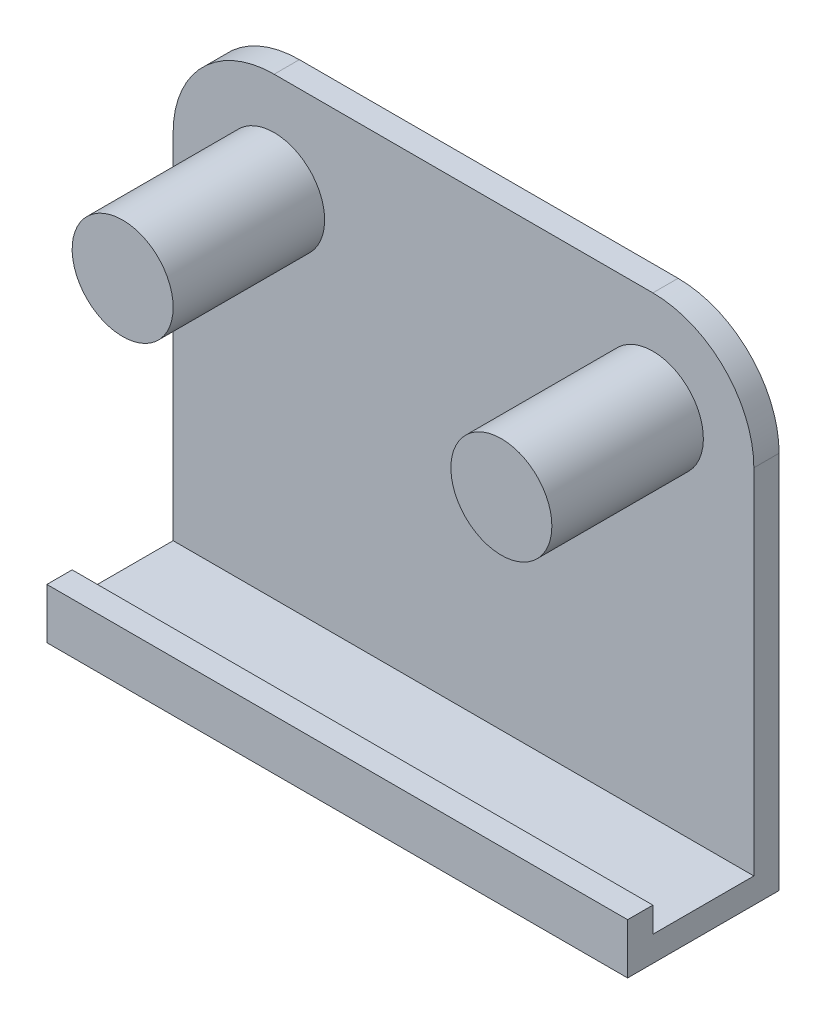
ISO-10303-21;
HEADER;
FILE_DESCRIPTION(('STEP AP214'),'2;1');
FILE_NAME('part.step','',(''),(''),'','','');
FILE_SCHEMA(('AUTOMOTIVE_DESIGN { 1 0 10303 214 1 1 1 1 }'));
ENDSEC;
DATA;
#1=APPLICATION_CONTEXT('core data for automotive mechanical design processes');
#2=APPLICATION_PROTOCOL_DEFINITION('international standard','automotive_design',2000,#1);
#3=PRODUCT_CONTEXT('',#1,'mechanical');
#4=PRODUCT('Part','Part','',(#3));
#5=PRODUCT_RELATED_PRODUCT_CATEGORY('part','',(#4));
#6=PRODUCT_DEFINITION_FORMATION('','',#4);
#7=PRODUCT_DEFINITION_CONTEXT('part definition',#1,'design');
#8=PRODUCT_DEFINITION('design','',#6,#7);
#9=PRODUCT_DEFINITION_SHAPE('','',#8);
#10=(LENGTH_UNIT() NAMED_UNIT(*) SI_UNIT(.MILLI.,.METRE.));
#11=(NAMED_UNIT(*) PLANE_ANGLE_UNIT() SI_UNIT($,.RADIAN.));
#12=(NAMED_UNIT(*) SI_UNIT($,.STERADIAN.) SOLID_ANGLE_UNIT());
#13=UNCERTAINTY_MEASURE_WITH_UNIT(LENGTH_MEASURE(1.E-05),#10,'distance_accuracy_value','');
#14=(GEOMETRIC_REPRESENTATION_CONTEXT(3) GLOBAL_UNCERTAINTY_ASSIGNED_CONTEXT((#13)) GLOBAL_UNIT_ASSIGNED_CONTEXT((#10,
#11,#12)) REPRESENTATION_CONTEXT('',''));
#15=CARTESIAN_POINT('',(0.,0.,0.));
#16=DIRECTION('',(0.,0.,1.));
#17=DIRECTION('',(1.,0.,0.));
#18=AXIS2_PLACEMENT_3D('',#15,#16,#17);
#19=CARTESIAN_POINT('',(115.,0.,25.));
#20=DIRECTION('',(0.,0.,1.));
#21=DIRECTION('',(1.,0.,0.));
#22=AXIS2_PLACEMENT_3D('',#19,#20,#21);
#23=PLANE('',#22);
#24=DIRECTION('',(0.,1.,0.));
#25=VECTOR('',#24,1.);
#26=CARTESIAN_POINT('',(0.,0.,25.));
#27=LINE('',#26,#25);
#28=CARTESIAN_POINT('',(0.,5.,25.));
#29=VERTEX_POINT('',#28);
#30=CARTESIAN_POINT('',(0.,10.,25.));
#31=VERTEX_POINT('',#30);
#32=EDGE_CURVE('E129',#29,#31,#27,.T.);
#33=ORIENTED_EDGE('',*,*,#32,.T.);
#34=DIRECTION('',(-1.,0.,0.));
#35=VECTOR('',#34,1.);
#36=CARTESIAN_POINT('',(115.,10.,25.));
#37=LINE('',#36,#35);
#38=CARTESIAN_POINT('',(115.,10.,25.));
#39=VERTEX_POINT('',#38);
#40=EDGE_CURVE('E127',#39,#31,#37,.T.);
#41=ORIENTED_EDGE('',*,*,#40,.F.);
#42=DIRECTION('',(0.,1.,0.));
#43=VECTOR('',#42,1.);
#44=CARTESIAN_POINT('',(115.,0.,25.));
#45=LINE('',#44,#43);
#46=CARTESIAN_POINT('',(115.,5.,25.));
#47=VERTEX_POINT('',#46);
#48=EDGE_CURVE('E112',#47,#39,#45,.T.);
#49=ORIENTED_EDGE('',*,*,#48,.F.);
#50=DIRECTION('',(-1.,0.,0.));
#51=VECTOR('',#50,1.);
#52=CARTESIAN_POINT('',(115.,5.,25.));
#53=LINE('',#52,#51);
#54=EDGE_CURVE('E150',#47,#29,#53,.T.);
#55=ORIENTED_EDGE('',*,*,#54,.T.);
#56=EDGE_LOOP('',(#33,#41,#49,#55));
#57=FACE_BOUND('',#56,.T.);
#58=ADVANCED_FACE('F33',(#57),#23,.F.);
#59=CARTESIAN_POINT('',(115.,10.,30.));
#60=DIRECTION('',(0.,1.,0.));
#61=DIRECTION('',(0.,0.,1.));
#62=AXIS2_PLACEMENT_3D('',#59,#60,#61);
#63=PLANE('',#62);
#64=DIRECTION('',(0.,0.,-1.));
#65=VECTOR('',#64,1.);
#66=CARTESIAN_POINT('',(0.,10.,30.));
#67=LINE('',#66,#65);
#68=CARTESIAN_POINT('',(0.,10.,30.));
#69=VERTEX_POINT('',#68);
#70=EDGE_CURVE('E152',#69,#31,#67,.T.);
#71=ORIENTED_EDGE('',*,*,#70,.F.);
#72=DIRECTION('',(-1.,0.,0.));
#73=VECTOR('',#72,1.);
#74=CARTESIAN_POINT('',(115.,10.,30.));
#75=LINE('',#74,#73);
#76=CARTESIAN_POINT('',(115.,10.,30.));
#77=VERTEX_POINT('',#76);
#78=EDGE_CURVE('E134',#77,#69,#75,.T.);
#79=ORIENTED_EDGE('',*,*,#78,.F.);
#80=DIRECTION('',(0.,0.,-1.));
#81=VECTOR('',#80,1.);
#82=CARTESIAN_POINT('',(115.,10.,30.));
#83=LINE('',#82,#81);
#84=EDGE_CURVE('E117',#77,#39,#83,.T.);
#85=ORIENTED_EDGE('',*,*,#84,.T.);
#86=ORIENTED_EDGE('',*,*,#40,.T.);
#87=EDGE_LOOP('',(#71,#79,#85,#86));
#88=FACE_BOUND('',#87,.T.);
#89=ADVANCED_FACE('F136',(#88),#63,.T.);
#90=CARTESIAN_POINT('',(115.,0.,30.));
#91=DIRECTION('',(0.,0.,1.));
#92=DIRECTION('',(1.,0.,0.));
#93=AXIS2_PLACEMENT_3D('',#90,#91,#92);
#94=PLANE('',#93);
#95=DIRECTION('',(0.,1.,0.));
#96=VECTOR('',#95,1.);
#97=CARTESIAN_POINT('',(0.,0.,30.));
#98=LINE('',#97,#96);
#99=CARTESIAN_POINT('',(0.,0.,30.));
#100=VERTEX_POINT('',#99);
#101=EDGE_CURVE('E155',#100,#69,#98,.T.);
#102=ORIENTED_EDGE('',*,*,#101,.F.);
#103=DIRECTION('',(-1.,0.,0.));
#104=VECTOR('',#103,1.);
#105=CARTESIAN_POINT('',(115.,0.,30.));
#106=LINE('',#105,#104);
#107=CARTESIAN_POINT('',(115.,0.,30.));
#108=VERTEX_POINT('',#107);
#109=EDGE_CURVE('E177',#108,#100,#106,.T.);
#110=ORIENTED_EDGE('',*,*,#109,.F.);
#111=DIRECTION('',(0.,1.,0.));
#112=VECTOR('',#111,1.);
#113=CARTESIAN_POINT('',(115.,0.,30.));
#114=LINE('',#113,#112);
#115=EDGE_CURVE('E137',#108,#77,#114,.T.);
#116=ORIENTED_EDGE('',*,*,#115,.T.);
#117=ORIENTED_EDGE('',*,*,#78,.T.);
#118=EDGE_LOOP('',(#102,#110,#116,#117));
#119=FACE_BOUND('',#118,.T.);
#120=ADVANCED_FACE('F227',(#119),#94,.T.);
#121=CARTESIAN_POINT('',(115.,0.,0.));
#122=DIRECTION('',(0.,-1.,0.));
#123=DIRECTION('',(0.,0.,-1.));
#124=AXIS2_PLACEMENT_3D('',#121,#122,#123);
#125=PLANE('',#124);
#126=DIRECTION('',(0.,0.,1.));
#127=VECTOR('',#126,1.);
#128=CARTESIAN_POINT('',(0.,0.,0.));
#129=LINE('',#128,#127);
#130=CARTESIAN_POINT('',(0.,0.,0.));
#131=VERTEX_POINT('',#130);
#132=EDGE_CURVE('E158',#131,#100,#129,.T.);
#133=ORIENTED_EDGE('',*,*,#132,.F.);
#134=DIRECTION('',(-1.,0.,0.));
#135=VECTOR('',#134,1.);
#136=CARTESIAN_POINT('',(115.,0.,0.));
#137=LINE('',#136,#135);
#138=CARTESIAN_POINT('',(115.,0.,0.));
#139=VERTEX_POINT('',#138);
#140=EDGE_CURVE('E174',#139,#131,#137,.T.);
#141=ORIENTED_EDGE('',*,*,#140,.F.);
#142=DIRECTION('',(0.,0.,1.));
#143=VECTOR('',#142,1.);
#144=CARTESIAN_POINT('',(115.,0.,0.));
#145=LINE('',#144,#143);
#146=EDGE_CURVE('E139',#139,#108,#145,.T.);
#147=ORIENTED_EDGE('',*,*,#146,.T.);
#148=ORIENTED_EDGE('',*,*,#109,.T.);
#149=EDGE_LOOP('',(#133,#141,#147,#148));
#150=FACE_BOUND('',#149,.T.);
#151=ADVANCED_FACE('F224',(#150),#125,.T.);
#152=CARTESIAN_POINT('',(115.,95.,0.));
#153=DIRECTION('',(0.,0.,-1.));
#154=DIRECTION('',(0.,1.,0.));
#155=AXIS2_PLACEMENT_3D('',#152,#153,#154);
#156=PLANE('',#155);
#157=DIRECTION('',(0.,-1.,0.));
#158=VECTOR('',#157,1.);
#159=CARTESIAN_POINT('',(0.,95.,0.));
#160=LINE('',#159,#158);
#161=CARTESIAN_POINT('',(0.,75.,0.));
#162=VERTEX_POINT('',#161);
#163=EDGE_CURVE('E161',#162,#131,#160,.T.);
#164=ORIENTED_EDGE('',*,*,#163,.F.);
#165=CARTESIAN_POINT('',(20.,75.,0.));
#166=DIRECTION('',(0.,0.,-1.));
#167=DIRECTION('',(0.,1.,0.));
#168=AXIS2_PLACEMENT_3D('',#165,#166,#167);
#169=CIRCLE('',#168,20.);
#170=CARTESIAN_POINT('',(20.,95.,0.));
#171=VERTEX_POINT('',#170);
#172=EDGE_CURVE('E184',#162,#171,#169,.T.);
#173=ORIENTED_EDGE('',*,*,#172,.T.);
#174=DIRECTION('',(-1.,0.,0.));
#175=VECTOR('',#174,1.);
#176=CARTESIAN_POINT('',(115.,95.,0.));
#177=LINE('',#176,#175);
#178=CARTESIAN_POINT('',(95.,95.,0.));
#179=VERTEX_POINT('',#178);
#180=EDGE_CURVE('E172',#179,#171,#177,.T.);
#181=ORIENTED_EDGE('',*,*,#180,.F.);
#182=CARTESIAN_POINT('',(95.,75.,0.));
#183=DIRECTION('',(0.,0.,-1.));
#184=DIRECTION('',(0.,1.,0.));
#185=AXIS2_PLACEMENT_3D('',#182,#183,#184);
#186=CIRCLE('',#185,20.);
#187=CARTESIAN_POINT('',(115.,75.,0.));
#188=VERTEX_POINT('',#187);
#189=EDGE_CURVE('E182',#179,#188,#186,.T.);
#190=ORIENTED_EDGE('',*,*,#189,.T.);
#191=DIRECTION('',(0.,-1.,0.));
#192=VECTOR('',#191,1.);
#193=CARTESIAN_POINT('',(115.,95.,0.));
#194=LINE('',#193,#192);
#195=EDGE_CURVE('E145',#188,#139,#194,.T.);
#196=ORIENTED_EDGE('',*,*,#195,.T.);
#197=ORIENTED_EDGE('',*,*,#140,.T.);
#198=EDGE_LOOP('',(#164,#173,#181,#190,#196,#197));
#199=FACE_BOUND('',#198,.T.);
#200=ADVANCED_FACE('F218',(#199),#156,.T.);
#201=CARTESIAN_POINT('',(115.,95.,5.));
#202=DIRECTION('',(0.,1.,0.));
#203=DIRECTION('',(0.,0.,1.));
#204=AXIS2_PLACEMENT_3D('',#201,#202,#203);
#205=PLANE('',#204);
#206=ORIENTED_EDGE('',*,*,#180,.T.);
#207=DIRECTION('',(0.,0.,-1.));
#208=VECTOR('',#207,1.);
#209=CARTESIAN_POINT('',(20.,95.,5.));
#210=LINE('',#209,#208);
#211=CARTESIAN_POINT('',(20.,95.,5.));
#212=VERTEX_POINT('',#211);
#213=EDGE_CURVE('E56',#171,#212,#210,.F.);
#214=ORIENTED_EDGE('',*,*,#213,.T.);
#215=DIRECTION('',(-1.,0.,0.));
#216=VECTOR('',#215,1.);
#217=CARTESIAN_POINT('',(115.,95.,5.));
#218=LINE('',#217,#216);
#219=CARTESIAN_POINT('',(95.,95.,5.));
#220=VERTEX_POINT('',#219);
#221=EDGE_CURVE('E170',#220,#212,#218,.T.);
#222=ORIENTED_EDGE('',*,*,#221,.F.);
#223=DIRECTION('',(0.,0.,-1.));
#224=VECTOR('',#223,1.);
#225=CARTESIAN_POINT('',(95.,95.,0.));
#226=LINE('',#225,#224);
#227=EDGE_CURVE('E186',#220,#179,#226,.T.);
#228=ORIENTED_EDGE('',*,*,#227,.T.);
#229=EDGE_LOOP('',(#206,#214,#222,#228));
#230=FACE_BOUND('',#229,.T.);
#231=ADVANCED_FACE('F203',(#230),#205,.T.);
#232=CARTESIAN_POINT('',(115.,95.,5.));
#233=DIRECTION('',(0.,0.,-1.));
#234=DIRECTION('',(0.,1.,0.));
#235=AXIS2_PLACEMENT_3D('',#232,#233,#234);
#236=PLANE('',#235);
#237=CARTESIAN_POINT('',(95.,75.,5.));
#238=DIRECTION('',(0.,0.,-1.));
#239=DIRECTION('',(0.,1.,0.));
#240=AXIS2_PLACEMENT_3D('',#237,#238,#239);
#241=CIRCLE('',#240,9.99999999999999);
#242=CARTESIAN_POINT('',(95.,85.,5.));
#243=VERTEX_POINT('',#242);
#244=EDGE_CURVE('E11',#243,#243,#241,.F.);
#245=ORIENTED_EDGE('',*,*,#244,.F.);
#246=EDGE_LOOP('',(#245));
#247=FACE_BOUND('',#246,.T.);
#248=CARTESIAN_POINT('',(20.,75.,5.));
#249=DIRECTION('',(0.,0.,-1.));
#250=DIRECTION('',(0.,1.,0.));
#251=AXIS2_PLACEMENT_3D('',#248,#249,#250);
#252=CIRCLE('',#251,10.);
#253=CARTESIAN_POINT('',(20.,85.,5.));
#254=VERTEX_POINT('',#253);
#255=EDGE_CURVE('E41',#254,#254,#252,.F.);
#256=ORIENTED_EDGE('',*,*,#255,.F.);
#257=EDGE_LOOP('',(#256));
#258=FACE_BOUND('',#257,.T.);
#259=ORIENTED_EDGE('',*,*,#221,.T.);
#260=CARTESIAN_POINT('',(20.,75.,5.));
#261=DIRECTION('',(0.,0.,-1.));
#262=DIRECTION('',(0.,1.,0.));
#263=AXIS2_PLACEMENT_3D('',#260,#261,#262);
#264=CIRCLE('',#263,20.);
#265=CARTESIAN_POINT('',(0.,75.,5.));
#266=VERTEX_POINT('',#265);
#267=EDGE_CURVE('E192',#212,#266,#264,.F.);
#268=ORIENTED_EDGE('',*,*,#267,.T.);
#269=DIRECTION('',(0.,-1.,0.));
#270=VECTOR('',#269,1.);
#271=CARTESIAN_POINT('',(0.,95.,5.));
#272=LINE('',#271,#270);
#273=CARTESIAN_POINT('',(0.,5.,5.));
#274=VERTEX_POINT('',#273);
#275=EDGE_CURVE('E163',#266,#274,#272,.T.);
#276=ORIENTED_EDGE('',*,*,#275,.T.);
#277=DIRECTION('',(-1.,0.,0.));
#278=VECTOR('',#277,1.);
#279=CARTESIAN_POINT('',(115.,5.,5.));
#280=LINE('',#279,#278);
#281=CARTESIAN_POINT('',(115.,5.,5.));
#282=VERTEX_POINT('',#281);
#283=EDGE_CURVE('E167',#282,#274,#280,.T.);
#284=ORIENTED_EDGE('',*,*,#283,.F.);
#285=DIRECTION('',(0.,-1.,0.));
#286=VECTOR('',#285,1.);
#287=CARTESIAN_POINT('',(115.,95.,5.));
#288=LINE('',#287,#286);
#289=CARTESIAN_POINT('',(115.,75.,5.));
#290=VERTEX_POINT('',#289);
#291=EDGE_CURVE('E147',#290,#282,#288,.T.);
#292=ORIENTED_EDGE('',*,*,#291,.F.);
#293=CARTESIAN_POINT('',(95.,75.,5.));
#294=DIRECTION('',(0.,0.,-1.));
#295=DIRECTION('',(0.,1.,0.));
#296=AXIS2_PLACEMENT_3D('',#293,#294,#295);
#297=CIRCLE('',#296,20.);
#298=EDGE_CURVE('E190',#290,#220,#297,.F.);
#299=ORIENTED_EDGE('',*,*,#298,.T.);
#300=EDGE_LOOP('',(#259,#268,#276,#284,#292,#299));
#301=FACE_BOUND('',#300,.T.);
#302=ADVANCED_FACE('F199',(#247,#258,#301),#236,.F.);
#303=CARTESIAN_POINT('',(115.,5.,0.));
#304=DIRECTION('',(0.,-1.,0.));
#305=DIRECTION('',(0.,0.,-1.));
#306=AXIS2_PLACEMENT_3D('',#303,#304,#305);
#307=PLANE('',#306);
#308=DIRECTION('',(0.,0.,1.));
#309=VECTOR('',#308,1.);
#310=CARTESIAN_POINT('',(0.,5.,0.));
#311=LINE('',#310,#309);
#312=EDGE_CURVE('E124',#274,#29,#311,.T.);
#313=ORIENTED_EDGE('',*,*,#312,.T.);
#314=ORIENTED_EDGE('',*,*,#54,.F.);
#315=DIRECTION('',(0.,0.,1.));
#316=VECTOR('',#315,1.);
#317=CARTESIAN_POINT('',(115.,5.,0.));
#318=LINE('',#317,#316);
#319=EDGE_CURVE('E120',#282,#47,#318,.T.);
#320=ORIENTED_EDGE('',*,*,#319,.F.);
#321=ORIENTED_EDGE('',*,*,#283,.T.);
#322=EDGE_LOOP('',(#313,#314,#320,#321));
#323=FACE_BOUND('',#322,.T.);
#324=ADVANCED_FACE('F202',(#323),#307,.F.);
#325=CARTESIAN_POINT('',(115.,0.,0.));
#326=DIRECTION('',(-1.,0.,0.));
#327=DIRECTION('',(0.,0.,1.));
#328=AXIS2_PLACEMENT_3D('',#325,#326,#327);
#329=PLANE('',#328);
#330=ORIENTED_EDGE('',*,*,#195,.F.);
#331=DIRECTION('',(0.,0.,-1.));
#332=VECTOR('',#331,1.);
#333=CARTESIAN_POINT('',(115.,75.,5.));
#334=LINE('',#333,#332);
#335=EDGE_CURVE('E48',#188,#290,#334,.F.);
#336=ORIENTED_EDGE('',*,*,#335,.T.);
#337=ORIENTED_EDGE('',*,*,#291,.T.);
#338=ORIENTED_EDGE('',*,*,#319,.T.);
#339=ORIENTED_EDGE('',*,*,#48,.T.);
#340=ORIENTED_EDGE('',*,*,#84,.F.);
#341=ORIENTED_EDGE('',*,*,#115,.F.);
#342=ORIENTED_EDGE('',*,*,#146,.F.);
#343=EDGE_LOOP('',(#330,#336,#337,#338,#339,#340,#341,#342));
#344=FACE_BOUND('',#343,.T.);
#345=ADVANCED_FACE('F114',(#344),#329,.F.);
#346=CARTESIAN_POINT('',(0.,0.,0.));
#347=DIRECTION('',(-1.,0.,0.));
#348=DIRECTION('',(0.,0.,1.));
#349=AXIS2_PLACEMENT_3D('',#346,#347,#348);
#350=PLANE('',#349);
#351=ORIENTED_EDGE('',*,*,#275,.F.);
#352=DIRECTION('',(0.,0.,-1.));
#353=VECTOR('',#352,1.);
#354=CARTESIAN_POINT('',(0.,75.,0.));
#355=LINE('',#354,#353);
#356=EDGE_CURVE('E133',#266,#162,#355,.T.);
#357=ORIENTED_EDGE('',*,*,#356,.T.);
#358=ORIENTED_EDGE('',*,*,#163,.T.);
#359=ORIENTED_EDGE('',*,*,#132,.T.);
#360=ORIENTED_EDGE('',*,*,#101,.T.);
#361=ORIENTED_EDGE('',*,*,#70,.T.);
#362=ORIENTED_EDGE('',*,*,#32,.F.);
#363=ORIENTED_EDGE('',*,*,#312,.F.);
#364=EDGE_LOOP('',(#351,#357,#358,#359,#360,#361,#362,#363));
#365=FACE_BOUND('',#364,.T.);
#366=ADVANCED_FACE('F215',(#365),#350,.T.);
#367=CARTESIAN_POINT('',(20.,75.,0.));
#368=DIRECTION('',(0.,0.,-1.));
#369=DIRECTION('',(-1.,0.,0.));
#370=AXIS2_PLACEMENT_3D('',#367,#368,#369);
#371=CYLINDRICAL_SURFACE('',#370,20.);
#372=ORIENTED_EDGE('',*,*,#267,.F.);
#373=ORIENTED_EDGE('',*,*,#213,.F.);
#374=ORIENTED_EDGE('',*,*,#172,.F.);
#375=ORIENTED_EDGE('',*,*,#356,.F.);
#376=EDGE_LOOP('',(#372,#373,#374,#375));
#377=FACE_BOUND('',#376,.T.);
#378=ADVANCED_FACE('F212',(#377),#371,.T.);
#379=CARTESIAN_POINT('',(95.,75.,5.));
#380=DIRECTION('',(0.,0.,1.));
#381=DIRECTION('',(1.,0.,0.));
#382=AXIS2_PLACEMENT_3D('',#379,#380,#381);
#383=CYLINDRICAL_SURFACE('',#382,20.);
#384=ORIENTED_EDGE('',*,*,#298,.F.);
#385=ORIENTED_EDGE('',*,*,#335,.F.);
#386=ORIENTED_EDGE('',*,*,#189,.F.);
#387=ORIENTED_EDGE('',*,*,#227,.F.);
#388=EDGE_LOOP('',(#384,#385,#386,#387));
#389=FACE_BOUND('',#388,.T.);
#390=ADVANCED_FACE('F35',(#389),#383,.T.);
#391=CARTESIAN_POINT('',(20.,75.,35.));
#392=DIRECTION('',(0.,0.,-1.));
#393=DIRECTION('',(-1.,0.,0.));
#394=AXIS2_PLACEMENT_3D('',#391,#392,#393);
#395=CYLINDRICAL_SURFACE('',#394,10.);
#396=CARTESIAN_POINT('',(20.,75.,35.));
#397=DIRECTION('',(0.,0.,1.));
#398=DIRECTION('',(1.,0.,0.));
#399=AXIS2_PLACEMENT_3D('',#396,#397,#398);
#400=CIRCLE('',#399,10.);
#401=CARTESIAN_POINT('',(30.,75.,35.));
#402=VERTEX_POINT('',#401);
#403=EDGE_CURVE('E153',#402,#402,#400,.T.);
#404=ORIENTED_EDGE('',*,*,#403,.F.);
#405=EDGE_LOOP('',(#404));
#406=FACE_BOUND('',#405,.T.);
#407=ORIENTED_EDGE('',*,*,#255,.T.);
#408=EDGE_LOOP('',(#407));
#409=FACE_BOUND('',#408,.T.);
#410=ADVANCED_FACE('F197',(#406,#409),#395,.T.);
#411=CARTESIAN_POINT('',(20.,75.,35.));
#412=DIRECTION('',(0.,0.,1.));
#413=DIRECTION('',(1.,0.,0.));
#414=AXIS2_PLACEMENT_3D('',#411,#412,#413);
#415=PLANE('',#414);
#416=ORIENTED_EDGE('',*,*,#403,.T.);
#417=EDGE_LOOP('',(#416));
#418=FACE_BOUND('',#417,.T.);
#419=ADVANCED_FACE('F296',(#418),#415,.T.);
#420=CARTESIAN_POINT('',(95.,75.,35.));
#421=DIRECTION('',(0.,0.,-1.));
#422=DIRECTION('',(-1.,0.,0.));
#423=AXIS2_PLACEMENT_3D('',#420,#421,#422);
#424=CYLINDRICAL_SURFACE('',#423,9.99999999999999);
#425=CARTESIAN_POINT('',(95.,75.,35.));
#426=DIRECTION('',(0.,0.,1.));
#427=DIRECTION('',(1.,0.,0.));
#428=AXIS2_PLACEMENT_3D('',#425,#426,#427);
#429=CIRCLE('',#428,9.99999999999999);
#430=CARTESIAN_POINT('',(105.,75.,35.));
#431=VERTEX_POINT('',#430);
#432=EDGE_CURVE('E331',#431,#431,#429,.T.);
#433=ORIENTED_EDGE('',*,*,#432,.F.);
#434=EDGE_LOOP('',(#433));
#435=FACE_BOUND('',#434,.T.);
#436=ORIENTED_EDGE('',*,*,#244,.T.);
#437=EDGE_LOOP('',(#436));
#438=FACE_BOUND('',#437,.T.);
#439=ADVANCED_FACE('F305',(#435,#438),#424,.T.);
#440=CARTESIAN_POINT('',(95.,75.,35.));
#441=DIRECTION('',(0.,0.,1.));
#442=DIRECTION('',(1.,0.,0.));
#443=AXIS2_PLACEMENT_3D('',#440,#441,#442);
#444=PLANE('',#443);
#445=ORIENTED_EDGE('',*,*,#432,.T.);
#446=EDGE_LOOP('',(#445));
#447=FACE_BOUND('',#446,.T.);
#448=ADVANCED_FACE('F315',(#447),#444,.T.);
#449=CLOSED_SHELL('',(#58,#89,#120,#151,#200,#231,#302,#324,#345,#366,#378,#390,#410,#419,#439,#448));
#450=MANIFOLD_SOLID_BREP('B2',#449);
#451=ADVANCED_BREP_SHAPE_REPRESENTATION('',(#18,#450),#14);
#452=SHAPE_DEFINITION_REPRESENTATION(#9,#451);
ENDSEC;
END-ISO-10303-21;
